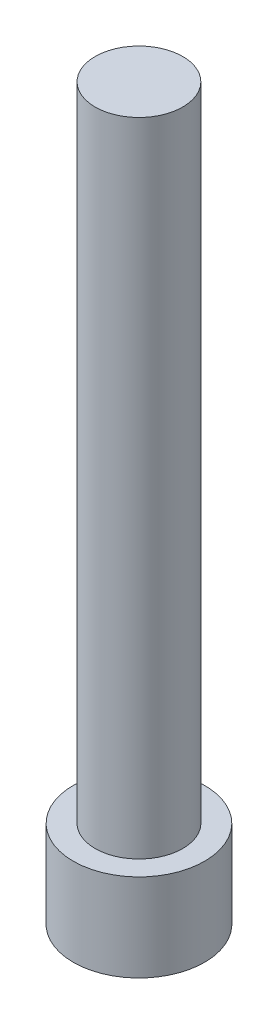
ISO-10303-21;
HEADER;
FILE_DESCRIPTION(('STEP AP214'),'2;1');
FILE_NAME('part.step','',(''),(''),'','','');
FILE_SCHEMA(('AUTOMOTIVE_DESIGN { 1 0 10303 214 1 1 1 1 }'));
ENDSEC;
DATA;
#1=APPLICATION_CONTEXT('core data for automotive mechanical design processes');
#2=APPLICATION_PROTOCOL_DEFINITION('international standard','automotive_design',2000,#1);
#3=PRODUCT_CONTEXT('',#1,'mechanical');
#4=PRODUCT('Part','Part','',(#3));
#5=PRODUCT_RELATED_PRODUCT_CATEGORY('part','',(#4));
#6=PRODUCT_DEFINITION_FORMATION('','',#4);
#7=PRODUCT_DEFINITION_CONTEXT('part definition',#1,'design');
#8=PRODUCT_DEFINITION('design','',#6,#7);
#9=PRODUCT_DEFINITION_SHAPE('','',#8);
#10=(LENGTH_UNIT() NAMED_UNIT(*) SI_UNIT(.MILLI.,.METRE.));
#11=(NAMED_UNIT(*) PLANE_ANGLE_UNIT() SI_UNIT($,.RADIAN.));
#12=(NAMED_UNIT(*) SI_UNIT($,.STERADIAN.) SOLID_ANGLE_UNIT());
#13=UNCERTAINTY_MEASURE_WITH_UNIT(LENGTH_MEASURE(1.E-05),#10,'distance_accuracy_value','');
#14=(GEOMETRIC_REPRESENTATION_CONTEXT(3) GLOBAL_UNCERTAINTY_ASSIGNED_CONTEXT((#13)) GLOBAL_UNIT_ASSIGNED_CONTEXT((#10,
#11,#12)) REPRESENTATION_CONTEXT('',''));
#15=CARTESIAN_POINT('',(0.,0.,0.));
#16=DIRECTION('',(0.,0.,1.));
#17=DIRECTION('',(1.,0.,0.));
#18=AXIS2_PLACEMENT_3D('',#15,#16,#17);
#19=CARTESIAN_POINT('',(0.,3.,0.));
#20=DIRECTION('',(0.,-1.,0.));
#21=DIRECTION('',(0.,0.,-1.));
#22=AXIS2_PLACEMENT_3D('',#19,#20,#21);
#23=CYLINDRICAL_SURFACE('',#22,2.25);
#24=CARTESIAN_POINT('',(0.,3.,0.));
#25=DIRECTION('',(0.,1.,0.));
#26=DIRECTION('',(0.,0.,1.));
#27=AXIS2_PLACEMENT_3D('',#24,#25,#26);
#28=CIRCLE('',#27,2.25);
#29=CARTESIAN_POINT('',(0.,3.,2.25));
#30=VERTEX_POINT('',#29);
#31=EDGE_CURVE('E163',#30,#30,#28,.T.);
#32=ORIENTED_EDGE('',*,*,#31,.F.);
#33=EDGE_LOOP('',(#32));
#34=FACE_BOUND('',#33,.T.);
#35=CARTESIAN_POINT('',(0.,0.,0.));
#36=DIRECTION('',(0.,1.,0.));
#37=DIRECTION('',(0.,0.,1.));
#38=AXIS2_PLACEMENT_3D('',#35,#36,#37);
#39=CIRCLE('',#38,2.25);
#40=CARTESIAN_POINT('',(0.,0.,2.25));
#41=VERTEX_POINT('',#40);
#42=EDGE_CURVE('E158',#41,#41,#39,.T.);
#43=ORIENTED_EDGE('',*,*,#42,.T.);
#44=EDGE_LOOP('',(#43));
#45=FACE_BOUND('',#44,.T.);
#46=ADVANCED_FACE('F39',(#34,#45),#23,.T.);
#47=CARTESIAN_POINT('',(0.,3.,0.));
#48=DIRECTION('',(0.,1.,0.));
#49=DIRECTION('',(0.,0.,1.));
#50=AXIS2_PLACEMENT_3D('',#47,#48,#49);
#51=PLANE('',#50);
#52=CARTESIAN_POINT('',(0.,3.,0.));
#53=DIRECTION('',(0.,1.,0.));
#54=DIRECTION('',(0.,0.,1.));
#55=AXIS2_PLACEMENT_3D('',#52,#53,#54);
#56=CIRCLE('',#55,1.5);
#57=CARTESIAN_POINT('',(0.,3.,1.5));
#58=VERTEX_POINT('',#57);
#59=EDGE_CURVE('E159',#58,#58,#56,.T.);
#60=ORIENTED_EDGE('',*,*,#59,.F.);
#61=EDGE_LOOP('',(#60));
#62=FACE_BOUND('',#61,.T.);
#63=ORIENTED_EDGE('',*,*,#31,.T.);
#64=EDGE_LOOP('',(#63));
#65=FACE_BOUND('',#64,.T.);
#66=ADVANCED_FACE('F232',(#62,#65),#51,.T.);
#67=CARTESIAN_POINT('',(0.,0.,0.));
#68=DIRECTION('',(0.,1.,0.));
#69=DIRECTION('',(0.,0.,1.));
#70=AXIS2_PLACEMENT_3D('',#67,#68,#69);
#71=PLANE('',#70);
#72=DIRECTION('',(0.5,0.,0.866025403784439));
#73=VECTOR('',#72,1.);
#74=CARTESIAN_POINT('',(1.21160254037844,0.,-0.699519052838329));
#75=LINE('',#74,#73);
#76=CARTESIAN_POINT('',(1.61547005383793,0.,0.));
#77=VERTEX_POINT('',#76);
#78=CARTESIAN_POINT('',(0.807735026918963,0.,-1.39903810567666));
#79=VERTEX_POINT('',#78);
#80=EDGE_CURVE('E178',#77,#79,#75,.F.);
#81=ORIENTED_EDGE('',*,*,#80,.T.);
#82=DIRECTION('',(1.,0.,0.));
#83=VECTOR('',#82,1.);
#84=CARTESIAN_POINT('',(0.,0.,-1.39903810567666));
#85=LINE('',#84,#83);
#86=CARTESIAN_POINT('',(-0.807735026918962,0.,-1.39903810567666));
#87=VERTEX_POINT('',#86);
#88=EDGE_CURVE('E180',#79,#87,#85,.F.);
#89=ORIENTED_EDGE('',*,*,#88,.T.);
#90=DIRECTION('',(0.5,0.,-0.866025403784439));
#91=VECTOR('',#90,1.);
#92=CARTESIAN_POINT('',(-1.21160254037844,0.,-0.699519052838329));
#93=LINE('',#92,#91);
#94=CARTESIAN_POINT('',(-1.61547005383792,0.,0.));
#95=VERTEX_POINT('',#94);
#96=EDGE_CURVE('E172',#87,#95,#93,.F.);
#97=ORIENTED_EDGE('',*,*,#96,.T.);
#98=DIRECTION('',(-0.5,0.,-0.866025403784439));
#99=VECTOR('',#98,1.);
#100=CARTESIAN_POINT('',(-1.21160254037844,0.,0.699519052838329));
#101=LINE('',#100,#99);
#102=CARTESIAN_POINT('',(-0.807735026918963,0.,1.39903810567666));
#103=VERTEX_POINT('',#102);
#104=EDGE_CURVE('E170',#95,#103,#101,.F.);
#105=ORIENTED_EDGE('',*,*,#104,.T.);
#106=DIRECTION('',(-1.,0.,0.));
#107=VECTOR('',#106,1.);
#108=CARTESIAN_POINT('',(0.,0.,1.39903810567666));
#109=LINE('',#108,#107);
#110=CARTESIAN_POINT('',(0.807735026918963,0.,1.39903810567666));
#111=VERTEX_POINT('',#110);
#112=EDGE_CURVE('E174',#103,#111,#109,.F.);
#113=ORIENTED_EDGE('',*,*,#112,.T.);
#114=DIRECTION('',(-0.5,0.,0.866025403784439));
#115=VECTOR('',#114,1.);
#116=CARTESIAN_POINT('',(1.21160254037844,0.,0.699519052838329));
#117=LINE('',#116,#115);
#118=EDGE_CURVE('E176',#111,#77,#117,.F.);
#119=ORIENTED_EDGE('',*,*,#118,.T.);
#120=EDGE_LOOP('',(#81,#89,#97,#105,#113,#119));
#121=FACE_BOUND('',#120,.T.);
#122=ORIENTED_EDGE('',*,*,#42,.F.);
#123=EDGE_LOOP('',(#122));
#124=FACE_BOUND('',#123,.T.);
#125=ADVANCED_FACE('F238',(#121,#124),#71,.F.);
#126=CARTESIAN_POINT('',(0.,25.,0.));
#127=DIRECTION('',(0.,-1.,0.));
#128=DIRECTION('',(0.,0.,-1.));
#129=AXIS2_PLACEMENT_3D('',#126,#127,#128);
#130=CYLINDRICAL_SURFACE('',#129,1.5);
#131=CARTESIAN_POINT('',(0.,25.,0.));
#132=DIRECTION('',(0.,1.,0.));
#133=DIRECTION('',(0.,0.,1.));
#134=AXIS2_PLACEMENT_3D('',#131,#132,#133);
#135=CIRCLE('',#134,1.5);
#136=CARTESIAN_POINT('',(0.,25.,1.5));
#137=VERTEX_POINT('',#136);
#138=EDGE_CURVE('E146',#137,#137,#135,.T.);
#139=ORIENTED_EDGE('',*,*,#138,.F.);
#140=EDGE_LOOP('',(#139));
#141=FACE_BOUND('',#140,.T.);
#142=ORIENTED_EDGE('',*,*,#59,.T.);
#143=EDGE_LOOP('',(#142));
#144=FACE_BOUND('',#143,.T.);
#145=ADVANCED_FACE('F372',(#141,#144),#130,.T.);
#146=CARTESIAN_POINT('',(0.,25.,0.));
#147=DIRECTION('',(0.,1.,0.));
#148=DIRECTION('',(0.,0.,1.));
#149=AXIS2_PLACEMENT_3D('',#146,#147,#148);
#150=PLANE('',#149);
#151=ORIENTED_EDGE('',*,*,#138,.T.);
#152=EDGE_LOOP('',(#151));
#153=FACE_BOUND('',#152,.T.);
#154=ADVANCED_FACE('F363',(#153),#150,.T.);
#155=CARTESIAN_POINT('',(1.5,2.,0.));
#156=DIRECTION('',(0.866025403784439,0.,0.5));
#157=DIRECTION('',(0.5,0.,-0.866025403784439));
#158=AXIS2_PLACEMENT_3D('',#155,#156,#157);
#159=PLANE('',#158);
#160=DIRECTION('',(0.,-1.,0.));
#161=VECTOR('',#160,1.);
#162=CARTESIAN_POINT('',(1.5,2.,0.));
#163=LINE('',#162,#161);
#164=CARTESIAN_POINT('',(1.5,2.,0.));
#165=VERTEX_POINT('',#164);
#166=CARTESIAN_POINT('',(1.5,0.1,0.));
#167=VERTEX_POINT('',#166);
#168=EDGE_CURVE('E144',#165,#167,#163,.T.);
#169=ORIENTED_EDGE('',*,*,#168,.T.);
#170=DIRECTION('',(-0.5,0.,0.866025403784439));
#171=VECTOR('',#170,1.);
#172=CARTESIAN_POINT('',(1.5,0.1,0.));
#173=LINE('',#172,#171);
#174=CARTESIAN_POINT('',(0.75,0.1,1.29903810567666));
#175=VERTEX_POINT('',#174);
#176=EDGE_CURVE('E118',#167,#175,#173,.T.);
#177=ORIENTED_EDGE('',*,*,#176,.T.);
#178=DIRECTION('',(0.,-1.,0.));
#179=VECTOR('',#178,1.);
#180=CARTESIAN_POINT('',(0.75,2.,1.29903810567666));
#181=LINE('',#180,#179);
#182=CARTESIAN_POINT('',(0.75,2.,1.29903810567666));
#183=VERTEX_POINT('',#182);
#184=EDGE_CURVE('E110',#183,#175,#181,.T.);
#185=ORIENTED_EDGE('',*,*,#184,.F.);
#186=DIRECTION('',(-0.5,0.,0.866025403784439));
#187=VECTOR('',#186,1.);
#188=CARTESIAN_POINT('',(1.5,2.,0.));
#189=LINE('',#188,#187);
#190=EDGE_CURVE('E115',#165,#183,#189,.T.);
#191=ORIENTED_EDGE('',*,*,#190,.F.);
#192=EDGE_LOOP('',(#169,#177,#185,#191));
#193=FACE_BOUND('',#192,.T.);
#194=ADVANCED_FACE('F113',(#193),#159,.F.);
#195=CARTESIAN_POINT('',(0.75,2.,-1.29903810567666));
#196=DIRECTION('',(0.866025403784439,0.,-0.5));
#197=DIRECTION('',(-0.5,0.,-0.866025403784439));
#198=AXIS2_PLACEMENT_3D('',#195,#196,#197);
#199=PLANE('',#198);
#200=DIRECTION('',(0.,-1.,0.));
#201=VECTOR('',#200,1.);
#202=CARTESIAN_POINT('',(0.75,2.,-1.29903810567666));
#203=LINE('',#202,#201);
#204=CARTESIAN_POINT('',(0.75,2.,-1.29903810567666));
#205=VERTEX_POINT('',#204);
#206=CARTESIAN_POINT('',(0.75,0.1,-1.29903810567666));
#207=VERTEX_POINT('',#206);
#208=EDGE_CURVE('E147',#205,#207,#203,.T.);
#209=ORIENTED_EDGE('',*,*,#208,.T.);
#210=DIRECTION('',(0.5,0.,0.866025403784439));
#211=VECTOR('',#210,1.);
#212=CARTESIAN_POINT('',(0.75,0.1,-1.29903810567666));
#213=LINE('',#212,#211);
#214=EDGE_CURVE('E183',#207,#167,#213,.T.);
#215=ORIENTED_EDGE('',*,*,#214,.T.);
#216=ORIENTED_EDGE('',*,*,#168,.F.);
#217=DIRECTION('',(0.5,0.,0.866025403784439));
#218=VECTOR('',#217,1.);
#219=CARTESIAN_POINT('',(0.75,2.,-1.29903810567666));
#220=LINE('',#219,#218);
#221=EDGE_CURVE('E120',#205,#165,#220,.T.);
#222=ORIENTED_EDGE('',*,*,#221,.F.);
#223=EDGE_LOOP('',(#209,#215,#216,#222));
#224=FACE_BOUND('',#223,.T.);
#225=ADVANCED_FACE('F267',(#224),#199,.F.);
#226=CARTESIAN_POINT('',(-0.749999999999999,2.,-1.29903810567666));
#227=DIRECTION('',(0.,0.,-1.));
#228=DIRECTION('',(-1.,0.,0.));
#229=AXIS2_PLACEMENT_3D('',#226,#227,#228);
#230=PLANE('',#229);
#231=DIRECTION('',(0.,-1.,0.));
#232=VECTOR('',#231,1.);
#233=CARTESIAN_POINT('',(-0.749999999999999,2.,-1.29903810567666));
#234=LINE('',#233,#232);
#235=CARTESIAN_POINT('',(-0.749999999999999,2.,-1.29903810567666));
#236=VERTEX_POINT('',#235);
#237=CARTESIAN_POINT('',(-0.749999999999999,0.1,-1.29903810567666));
#238=VERTEX_POINT('',#237);
#239=EDGE_CURVE('E150',#236,#238,#234,.T.);
#240=ORIENTED_EDGE('',*,*,#239,.T.);
#241=DIRECTION('',(1.,0.,0.));
#242=VECTOR('',#241,1.);
#243=CARTESIAN_POINT('',(-0.749999999999999,0.1,-1.29903810567666));
#244=LINE('',#243,#242);
#245=EDGE_CURVE('E162',#238,#207,#244,.T.);
#246=ORIENTED_EDGE('',*,*,#245,.T.);
#247=ORIENTED_EDGE('',*,*,#208,.F.);
#248=DIRECTION('',(1.,0.,0.));
#249=VECTOR('',#248,1.);
#250=CARTESIAN_POINT('',(-0.749999999999999,2.,-1.29903810567666));
#251=LINE('',#250,#249);
#252=EDGE_CURVE('E141',#236,#205,#251,.T.);
#253=ORIENTED_EDGE('',*,*,#252,.F.);
#254=EDGE_LOOP('',(#240,#246,#247,#253));
#255=FACE_BOUND('',#254,.T.);
#256=ADVANCED_FACE('F221',(#255),#230,.F.);
#257=CARTESIAN_POINT('',(-1.5,2.,0.));
#258=DIRECTION('',(-0.866025403784439,0.,-0.5));
#259=DIRECTION('',(-0.5,0.,0.866025403784439));
#260=AXIS2_PLACEMENT_3D('',#257,#258,#259);
#261=PLANE('',#260);
#262=DIRECTION('',(0.,-1.,0.));
#263=VECTOR('',#262,1.);
#264=CARTESIAN_POINT('',(-1.5,2.,0.));
#265=LINE('',#264,#263);
#266=CARTESIAN_POINT('',(-1.5,2.,0.));
#267=VERTEX_POINT('',#266);
#268=CARTESIAN_POINT('',(-1.5,0.1,0.));
#269=VERTEX_POINT('',#268);
#270=EDGE_CURVE('E153',#267,#269,#265,.T.);
#271=ORIENTED_EDGE('',*,*,#270,.T.);
#272=DIRECTION('',(0.5,0.,-0.866025403784439));
#273=VECTOR('',#272,1.);
#274=CARTESIAN_POINT('',(-1.5,0.1,0.));
#275=LINE('',#274,#273);
#276=EDGE_CURVE('E48',#269,#238,#275,.T.);
#277=ORIENTED_EDGE('',*,*,#276,.T.);
#278=ORIENTED_EDGE('',*,*,#239,.F.);
#279=DIRECTION('',(0.5,0.,-0.866025403784439));
#280=VECTOR('',#279,1.);
#281=CARTESIAN_POINT('',(-1.5,2.,0.));
#282=LINE('',#281,#280);
#283=EDGE_CURVE('E138',#267,#236,#282,.T.);
#284=ORIENTED_EDGE('',*,*,#283,.F.);
#285=EDGE_LOOP('',(#271,#277,#278,#284));
#286=FACE_BOUND('',#285,.T.);
#287=ADVANCED_FACE('F217',(#286),#261,.F.);
#288=CARTESIAN_POINT('',(-0.75,2.,1.29903810567666));
#289=DIRECTION('',(-0.866025403784439,0.,0.5));
#290=DIRECTION('',(0.5,0.,0.866025403784439));
#291=AXIS2_PLACEMENT_3D('',#288,#289,#290);
#292=PLANE('',#291);
#293=DIRECTION('',(0.,-1.,0.));
#294=VECTOR('',#293,1.);
#295=CARTESIAN_POINT('',(-0.75,2.,1.29903810567666));
#296=LINE('',#295,#294);
#297=CARTESIAN_POINT('',(-0.75,2.,1.29903810567666));
#298=VERTEX_POINT('',#297);
#299=CARTESIAN_POINT('',(-0.75,0.1,1.29903810567666));
#300=VERTEX_POINT('',#299);
#301=EDGE_CURVE('E119',#298,#300,#296,.T.);
#302=ORIENTED_EDGE('',*,*,#301,.T.);
#303=DIRECTION('',(-0.5,0.,-0.866025403784439));
#304=VECTOR('',#303,1.);
#305=CARTESIAN_POINT('',(-0.75,0.1,1.29903810567666));
#306=LINE('',#305,#304);
#307=EDGE_CURVE('E11',#300,#269,#306,.T.);
#308=ORIENTED_EDGE('',*,*,#307,.T.);
#309=ORIENTED_EDGE('',*,*,#270,.F.);
#310=DIRECTION('',(-0.5,0.,-0.866025403784439));
#311=VECTOR('',#310,1.);
#312=CARTESIAN_POINT('',(-0.75,2.,1.29903810567666));
#313=LINE('',#312,#311);
#314=EDGE_CURVE('E128',#298,#267,#313,.T.);
#315=ORIENTED_EDGE('',*,*,#314,.F.);
#316=EDGE_LOOP('',(#302,#308,#309,#315));
#317=FACE_BOUND('',#316,.T.);
#318=ADVANCED_FACE('F222',(#317),#292,.F.);
#319=CARTESIAN_POINT('',(0.75,2.,1.29903810567666));
#320=DIRECTION('',(0.,0.,1.));
#321=DIRECTION('',(1.,0.,0.));
#322=AXIS2_PLACEMENT_3D('',#319,#320,#321);
#323=PLANE('',#322);
#324=ORIENTED_EDGE('',*,*,#184,.T.);
#325=DIRECTION('',(-1.,0.,0.));
#326=VECTOR('',#325,1.);
#327=CARTESIAN_POINT('',(0.75,0.1,1.29903810567666));
#328=LINE('',#327,#326);
#329=EDGE_CURVE('E62',#175,#300,#328,.T.);
#330=ORIENTED_EDGE('',*,*,#329,.T.);
#331=ORIENTED_EDGE('',*,*,#301,.F.);
#332=DIRECTION('',(-1.,0.,0.));
#333=VECTOR('',#332,1.);
#334=CARTESIAN_POINT('',(0.75,2.,1.29903810567666));
#335=LINE('',#334,#333);
#336=EDGE_CURVE('E123',#183,#298,#335,.T.);
#337=ORIENTED_EDGE('',*,*,#336,.F.);
#338=EDGE_LOOP('',(#324,#330,#331,#337));
#339=FACE_BOUND('',#338,.T.);
#340=ADVANCED_FACE('F124',(#339),#323,.F.);
#341=CARTESIAN_POINT('',(0.,2.,0.));
#342=DIRECTION('',(0.,-1.,0.));
#343=DIRECTION('',(0.,0.,-1.));
#344=AXIS2_PLACEMENT_3D('',#341,#342,#343);
#345=PLANE('',#344);
#346=ORIENTED_EDGE('',*,*,#190,.T.);
#347=ORIENTED_EDGE('',*,*,#336,.T.);
#348=ORIENTED_EDGE('',*,*,#314,.T.);
#349=ORIENTED_EDGE('',*,*,#283,.T.);
#350=ORIENTED_EDGE('',*,*,#252,.T.);
#351=ORIENTED_EDGE('',*,*,#221,.T.);
#352=EDGE_LOOP('',(#346,#347,#348,#349,#350,#351));
#353=FACE_BOUND('',#352,.T.);
#354=ADVANCED_FACE('F130',(#353),#345,.T.);
#355=CARTESIAN_POINT('',(0.75,0.1,1.39903810567666));
#356=DIRECTION('',(-1.,0.,0.));
#357=DIRECTION('',(0.,0.,1.));
#358=AXIS2_PLACEMENT_3D('',#355,#356,#357);
#359=CYLINDRICAL_SURFACE('',#358,0.1);
#360=CARTESIAN_POINT('',(0.807735026918962,0.1,1.39903810567666));
#361=DIRECTION('',(-0.866025403784439,0.,0.5));
#362=DIRECTION('',(0.5,0.,0.866025403784439));
#363=AXIS2_PLACEMENT_3D('',#360,#361,#362);
#364=ELLIPSE('',#363,0.115470053837925,0.1);
#365=EDGE_CURVE('E135',#111,#175,#364,.F.);
#366=ORIENTED_EDGE('',*,*,#365,.F.);
#367=ORIENTED_EDGE('',*,*,#112,.F.);
#368=CARTESIAN_POINT('',(-0.807735026918962,0.1,1.39903810567666));
#369=DIRECTION('',(-0.866025403784438,0.,-0.5));
#370=DIRECTION('',(-0.5,0.,0.866025403784439));
#371=AXIS2_PLACEMENT_3D('',#368,#369,#370);
#372=ELLIPSE('',#371,0.115470053837925,0.1);
#373=EDGE_CURVE('E43',#300,#103,#372,.T.);
#374=ORIENTED_EDGE('',*,*,#373,.F.);
#375=ORIENTED_EDGE('',*,*,#329,.F.);
#376=EDGE_LOOP('',(#366,#367,#374,#375));
#377=FACE_BOUND('',#376,.T.);
#378=ADVANCED_FACE('F41',(#377),#359,.T.);
#379=CARTESIAN_POINT('',(-0.836602540378444,0.1,1.34903810567666));
#380=DIRECTION('',(-0.5,0.,-0.866025403784439));
#381=DIRECTION('',(-0.866025403784439,0.,0.5));
#382=AXIS2_PLACEMENT_3D('',#379,#380,#381);
#383=CYLINDRICAL_SURFACE('',#382,0.1);
#384=ORIENTED_EDGE('',*,*,#373,.T.);
#385=ORIENTED_EDGE('',*,*,#104,.F.);
#386=CARTESIAN_POINT('',(-1.61547005383792,0.1,0.));
#387=DIRECTION('',(0.,0.,-1.));
#388=DIRECTION('',(1.,0.,0.));
#389=AXIS2_PLACEMENT_3D('',#386,#387,#388);
#390=ELLIPSE('',#389,0.115470053837925,0.1);
#391=EDGE_CURVE('E195',#269,#95,#390,.T.);
#392=ORIENTED_EDGE('',*,*,#391,.F.);
#393=ORIENTED_EDGE('',*,*,#307,.F.);
#394=EDGE_LOOP('',(#384,#385,#392,#393));
#395=FACE_BOUND('',#394,.T.);
#396=ADVANCED_FACE('F209',(#395),#383,.T.);
#397=CARTESIAN_POINT('',(1.58660254037844,0.1,0.05));
#398=DIRECTION('',(-0.5,0.,0.866025403784439));
#399=DIRECTION('',(0.866025403784439,0.,0.5));
#400=AXIS2_PLACEMENT_3D('',#397,#398,#399);
#401=CYLINDRICAL_SURFACE('',#400,0.1);
#402=ORIENTED_EDGE('',*,*,#365,.T.);
#403=ORIENTED_EDGE('',*,*,#176,.F.);
#404=CARTESIAN_POINT('',(1.61547005383792,0.1,0.));
#405=DIRECTION('',(0.,0.,1.));
#406=DIRECTION('',(1.,0.,0.));
#407=AXIS2_PLACEMENT_3D('',#404,#405,#406);
#408=ELLIPSE('',#407,0.115470053837925,0.1);
#409=EDGE_CURVE('E192',#77,#167,#408,.F.);
#410=ORIENTED_EDGE('',*,*,#409,.F.);
#411=ORIENTED_EDGE('',*,*,#118,.F.);
#412=EDGE_LOOP('',(#402,#403,#410,#411));
#413=FACE_BOUND('',#412,.T.);
#414=ADVANCED_FACE('F201',(#413),#401,.T.);
#415=CARTESIAN_POINT('',(-1.58660254037844,0.1,-0.0500000000000002));
#416=DIRECTION('',(0.5,0.,-0.866025403784439));
#417=DIRECTION('',(-0.866025403784439,0.,-0.5));
#418=AXIS2_PLACEMENT_3D('',#415,#416,#417);
#419=CYLINDRICAL_SURFACE('',#418,0.1);
#420=ORIENTED_EDGE('',*,*,#391,.T.);
#421=ORIENTED_EDGE('',*,*,#96,.F.);
#422=CARTESIAN_POINT('',(-0.807735026918962,0.1,-1.39903810567666));
#423=DIRECTION('',(0.866025403784439,0.,-0.5));
#424=DIRECTION('',(0.5,0.,0.866025403784439));
#425=AXIS2_PLACEMENT_3D('',#422,#423,#424);
#426=ELLIPSE('',#425,0.115470053837925,0.1);
#427=EDGE_CURVE('E190',#238,#87,#426,.T.);
#428=ORIENTED_EDGE('',*,*,#427,.F.);
#429=ORIENTED_EDGE('',*,*,#276,.F.);
#430=EDGE_LOOP('',(#420,#421,#428,#429));
#431=FACE_BOUND('',#430,.T.);
#432=ADVANCED_FACE('F214',(#431),#419,.T.);
#433=CARTESIAN_POINT('',(0.836602540378444,0.1,-1.34903810567666));
#434=DIRECTION('',(0.5,0.,0.866025403784439));
#435=DIRECTION('',(0.866025403784439,0.,-0.5));
#436=AXIS2_PLACEMENT_3D('',#433,#434,#435);
#437=CYLINDRICAL_SURFACE('',#436,0.1);
#438=ORIENTED_EDGE('',*,*,#409,.T.);
#439=ORIENTED_EDGE('',*,*,#214,.F.);
#440=CARTESIAN_POINT('',(0.807735026918962,0.1,-1.39903810567666));
#441=DIRECTION('',(0.866025403784439,0.,0.5));
#442=DIRECTION('',(0.5,0.,-0.866025403784439));
#443=AXIS2_PLACEMENT_3D('',#440,#441,#442);
#444=ELLIPSE('',#443,0.115470053837925,0.1);
#445=EDGE_CURVE('E188',#79,#207,#444,.F.);
#446=ORIENTED_EDGE('',*,*,#445,.F.);
#447=ORIENTED_EDGE('',*,*,#80,.F.);
#448=EDGE_LOOP('',(#438,#439,#446,#447));
#449=FACE_BOUND('',#448,.T.);
#450=ADVANCED_FACE('F248',(#449),#437,.T.);
#451=CARTESIAN_POINT('',(-0.749999999999999,0.1,-1.39903810567666));
#452=DIRECTION('',(1.,0.,0.));
#453=DIRECTION('',(0.,0.,-1.));
#454=AXIS2_PLACEMENT_3D('',#451,#452,#453);
#455=CYLINDRICAL_SURFACE('',#454,0.1);
#456=ORIENTED_EDGE('',*,*,#427,.T.);
#457=ORIENTED_EDGE('',*,*,#88,.F.);
#458=ORIENTED_EDGE('',*,*,#445,.T.);
#459=ORIENTED_EDGE('',*,*,#245,.F.);
#460=EDGE_LOOP('',(#456,#457,#458,#459));
#461=FACE_BOUND('',#460,.T.);
#462=ADVANCED_FACE('F245',(#461),#455,.T.);
#463=CLOSED_SHELL('',(#46,#66,#125,#145,#154,#194,#225,#256,#287,#318,#340,#354,#378,#396,#414,
#432,#450,#462));
#464=MANIFOLD_SOLID_BREP('B2',#463);
#465=ADVANCED_BREP_SHAPE_REPRESENTATION('',(#18,#464),#14);
#466=SHAPE_DEFINITION_REPRESENTATION(#9,#465);
ENDSEC;
END-ISO-10303-21;
